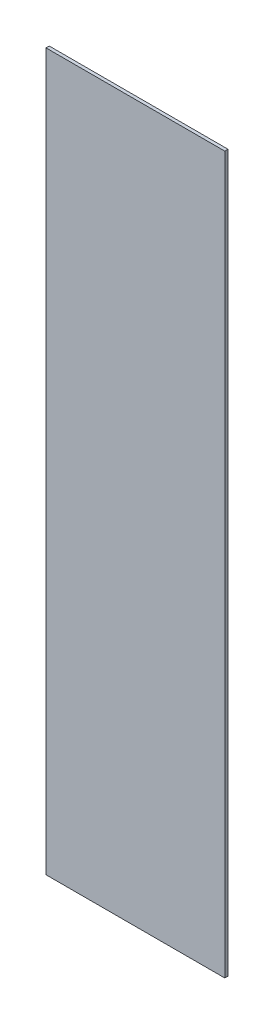
ISO-10303-21;
HEADER;
FILE_DESCRIPTION(('STEP AP214'),'2;1');
FILE_NAME('part.step','',(''),(''),'','','');
FILE_SCHEMA(('AUTOMOTIVE_DESIGN { 1 0 10303 214 1 1 1 1 }'));
ENDSEC;
DATA;
#1=APPLICATION_CONTEXT('core data for automotive mechanical design processes');
#2=APPLICATION_PROTOCOL_DEFINITION('international standard','automotive_design',2000,#1);
#3=PRODUCT_CONTEXT('',#1,'mechanical');
#4=PRODUCT('Part','Part','',(#3));
#5=PRODUCT_RELATED_PRODUCT_CATEGORY('part','',(#4));
#6=PRODUCT_DEFINITION_FORMATION('','',#4);
#7=PRODUCT_DEFINITION_CONTEXT('part definition',#1,'design');
#8=PRODUCT_DEFINITION('design','',#6,#7);
#9=PRODUCT_DEFINITION_SHAPE('','',#8);
#10=(LENGTH_UNIT() NAMED_UNIT(*) SI_UNIT(.MILLI.,.METRE.));
#11=(NAMED_UNIT(*) PLANE_ANGLE_UNIT() SI_UNIT($,.RADIAN.));
#12=(NAMED_UNIT(*) SI_UNIT($,.STERADIAN.) SOLID_ANGLE_UNIT());
#13=UNCERTAINTY_MEASURE_WITH_UNIT(LENGTH_MEASURE(1.E-05),#10,'distance_accuracy_value','');
#14=(GEOMETRIC_REPRESENTATION_CONTEXT(3) GLOBAL_UNCERTAINTY_ASSIGNED_CONTEXT((#13)) GLOBAL_UNIT_ASSIGNED_CONTEXT((#10,
#11,#12)) REPRESENTATION_CONTEXT('',''));
#15=CARTESIAN_POINT('',(0.,0.,0.));
#16=DIRECTION('',(0.,0.,1.));
#17=DIRECTION('',(1.,0.,0.));
#18=AXIS2_PLACEMENT_3D('',#15,#16,#17);
#19=CARTESIAN_POINT('',(0.,0.,1.5));
#20=DIRECTION('',(1.,0.,0.));
#21=DIRECTION('',(0.,0.,-1.));
#22=AXIS2_PLACEMENT_3D('',#19,#20,#21);
#23=PLANE('',#22);
#24=DIRECTION('',(0.,-1.,0.));
#25=VECTOR('',#24,1.);
#26=CARTESIAN_POINT('',(0.,0.,0.));
#27=LINE('',#26,#25);
#28=CARTESIAN_POINT('',(0.,332.5,0.));
#29=VERTEX_POINT('',#28);
#30=CARTESIAN_POINT('',(0.,0.,0.));
#31=VERTEX_POINT('',#30);
#32=EDGE_CURVE('E103',#29,#31,#27,.T.);
#33=ORIENTED_EDGE('',*,*,#32,.T.);
#34=DIRECTION('',(0.,0.,-1.));
#35=VECTOR('',#34,1.);
#36=CARTESIAN_POINT('',(0.,0.,1.5));
#37=LINE('',#36,#35);
#38=CARTESIAN_POINT('',(0.,0.,1.5));
#39=VERTEX_POINT('',#38);
#40=EDGE_CURVE('E11',#39,#31,#37,.T.);
#41=ORIENTED_EDGE('',*,*,#40,.F.);
#42=DIRECTION('',(0.,-1.,0.));
#43=VECTOR('',#42,1.);
#44=CARTESIAN_POINT('',(0.,0.,1.5));
#45=LINE('',#44,#43);
#46=CARTESIAN_POINT('',(0.,332.5,1.5));
#47=VERTEX_POINT('',#46);
#48=EDGE_CURVE('E91',#47,#39,#45,.T.);
#49=ORIENTED_EDGE('',*,*,#48,.F.);
#50=DIRECTION('',(0.,0.,-1.));
#51=VECTOR('',#50,1.);
#52=CARTESIAN_POINT('',(0.,332.5,1.5));
#53=LINE('',#52,#51);
#54=EDGE_CURVE('E99',#47,#29,#53,.T.);
#55=ORIENTED_EDGE('',*,*,#54,.T.);
#56=EDGE_LOOP('',(#33,#41,#49,#55));
#57=FACE_BOUND('',#56,.T.);
#58=ADVANCED_FACE('F40',(#57),#23,.F.);
#59=CARTESIAN_POINT('',(0.,0.,1.5));
#60=DIRECTION('',(0.,1.,0.));
#61=DIRECTION('',(0.,0.,1.));
#62=AXIS2_PLACEMENT_3D('',#59,#60,#61);
#63=PLANE('',#62);
#64=DIRECTION('',(1.,0.,0.));
#65=VECTOR('',#64,1.);
#66=CARTESIAN_POINT('',(0.,0.,0.));
#67=LINE('',#66,#65);
#68=CARTESIAN_POINT('',(83.,0.,0.));
#69=VERTEX_POINT('',#68);
#70=EDGE_CURVE('E95',#31,#69,#67,.T.);
#71=ORIENTED_EDGE('',*,*,#70,.T.);
#72=DIRECTION('',(0.,0.,-1.));
#73=VECTOR('',#72,1.);
#74=CARTESIAN_POINT('',(83.,0.,1.5));
#75=LINE('',#74,#73);
#76=CARTESIAN_POINT('',(83.,0.,1.5));
#77=VERTEX_POINT('',#76);
#78=EDGE_CURVE('E48',#77,#69,#75,.T.);
#79=ORIENTED_EDGE('',*,*,#78,.F.);
#80=DIRECTION('',(1.,0.,0.));
#81=VECTOR('',#80,1.);
#82=CARTESIAN_POINT('',(0.,0.,1.5));
#83=LINE('',#82,#81);
#84=EDGE_CURVE('E86',#39,#77,#83,.T.);
#85=ORIENTED_EDGE('',*,*,#84,.F.);
#86=ORIENTED_EDGE('',*,*,#40,.T.);
#87=EDGE_LOOP('',(#71,#79,#85,#86));
#88=FACE_BOUND('',#87,.T.);
#89=ADVANCED_FACE('F94',(#88),#63,.F.);
#90=CARTESIAN_POINT('',(83.,0.,1.5));
#91=DIRECTION('',(-1.,0.,0.));
#92=DIRECTION('',(0.,0.,1.));
#93=AXIS2_PLACEMENT_3D('',#90,#91,#92);
#94=PLANE('',#93);
#95=DIRECTION('',(0.,1.,0.));
#96=VECTOR('',#95,1.);
#97=CARTESIAN_POINT('',(83.,0.,0.));
#98=LINE('',#97,#96);
#99=CARTESIAN_POINT('',(83.,332.5,0.));
#100=VERTEX_POINT('',#99);
#101=EDGE_CURVE('E73',#69,#100,#98,.T.);
#102=ORIENTED_EDGE('',*,*,#101,.T.);
#103=DIRECTION('',(0.,0.,-1.));
#104=VECTOR('',#103,1.);
#105=CARTESIAN_POINT('',(83.,332.5,1.5));
#106=LINE('',#105,#104);
#107=CARTESIAN_POINT('',(83.,332.5,1.5));
#108=VERTEX_POINT('',#107);
#109=EDGE_CURVE('E96',#108,#100,#106,.T.);
#110=ORIENTED_EDGE('',*,*,#109,.F.);
#111=DIRECTION('',(0.,1.,0.));
#112=VECTOR('',#111,1.);
#113=CARTESIAN_POINT('',(83.,0.,1.5));
#114=LINE('',#113,#112);
#115=EDGE_CURVE('E89',#77,#108,#114,.T.);
#116=ORIENTED_EDGE('',*,*,#115,.F.);
#117=ORIENTED_EDGE('',*,*,#78,.T.);
#118=EDGE_LOOP('',(#102,#110,#116,#117));
#119=FACE_BOUND('',#118,.T.);
#120=ADVANCED_FACE('F97',(#119),#94,.F.);
#121=CARTESIAN_POINT('',(0.,332.5,1.5));
#122=DIRECTION('',(0.,-1.,0.));
#123=DIRECTION('',(0.,0.,-1.));
#124=AXIS2_PLACEMENT_3D('',#121,#122,#123);
#125=PLANE('',#124);
#126=DIRECTION('',(-1.,0.,0.));
#127=VECTOR('',#126,1.);
#128=CARTESIAN_POINT('',(0.,332.5,0.));
#129=LINE('',#128,#127);
#130=EDGE_CURVE('E79',#100,#29,#129,.T.);
#131=ORIENTED_EDGE('',*,*,#130,.T.);
#132=ORIENTED_EDGE('',*,*,#54,.F.);
#133=DIRECTION('',(-1.,0.,0.));
#134=VECTOR('',#133,1.);
#135=CARTESIAN_POINT('',(0.,332.5,1.5));
#136=LINE('',#135,#134);
#137=EDGE_CURVE('E56',#108,#47,#136,.T.);
#138=ORIENTED_EDGE('',*,*,#137,.F.);
#139=ORIENTED_EDGE('',*,*,#109,.T.);
#140=EDGE_LOOP('',(#131,#132,#138,#139));
#141=FACE_BOUND('',#140,.T.);
#142=ADVANCED_FACE('F110',(#141),#125,.F.);
#143=CARTESIAN_POINT('',(0.,0.,1.5));
#144=DIRECTION('',(0.,0.,-1.));
#145=DIRECTION('',(-1.,0.,0.));
#146=AXIS2_PLACEMENT_3D('',#143,#144,#145);
#147=PLANE('',#146);
#148=ORIENTED_EDGE('',*,*,#48,.T.);
#149=ORIENTED_EDGE('',*,*,#84,.T.);
#150=ORIENTED_EDGE('',*,*,#115,.T.);
#151=ORIENTED_EDGE('',*,*,#137,.T.);
#152=EDGE_LOOP('',(#148,#149,#150,#151));
#153=FACE_BOUND('',#152,.T.);
#154=ADVANCED_FACE('F87',(#153),#147,.F.);
#155=CARTESIAN_POINT('',(0.,0.,0.));
#156=DIRECTION('',(0.,0.,-1.));
#157=DIRECTION('',(-1.,0.,0.));
#158=AXIS2_PLACEMENT_3D('',#155,#156,#157);
#159=PLANE('',#158);
#160=ORIENTED_EDGE('',*,*,#32,.F.);
#161=ORIENTED_EDGE('',*,*,#130,.F.);
#162=ORIENTED_EDGE('',*,*,#101,.F.);
#163=ORIENTED_EDGE('',*,*,#70,.F.);
#164=EDGE_LOOP('',(#160,#161,#162,#163));
#165=FACE_BOUND('',#164,.T.);
#166=ADVANCED_FACE('F113',(#165),#159,.T.);
#167=CLOSED_SHELL('',(#58,#89,#120,#142,#154,#166));
#168=MANIFOLD_SOLID_BREP('B2',#167);
#169=ADVANCED_BREP_SHAPE_REPRESENTATION('',(#18,#168),#14);
#170=SHAPE_DEFINITION_REPRESENTATION(#9,#169);
ENDSEC;
END-ISO-10303-21;
